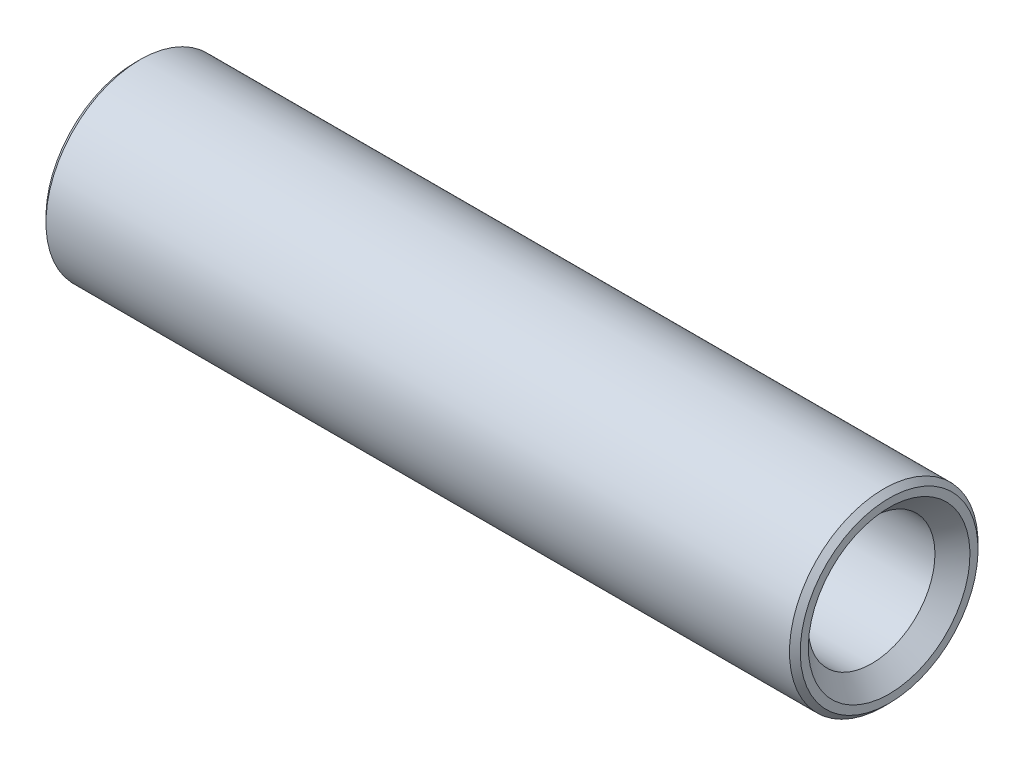
ISO-10303-21;
HEADER;
FILE_DESCRIPTION(('STEP AP214'),'2;1');
FILE_NAME('part.step','',(''),(''),'','','');
FILE_SCHEMA(('AUTOMOTIVE_DESIGN { 1 0 10303 214 1 1 1 1 }'));
ENDSEC;
DATA;
#1=APPLICATION_CONTEXT('core data for automotive mechanical design processes');
#2=APPLICATION_PROTOCOL_DEFINITION('international standard','automotive_design',2000,#1);
#3=PRODUCT_CONTEXT('',#1,'mechanical');
#4=PRODUCT('Part','Part','',(#3));
#5=PRODUCT_RELATED_PRODUCT_CATEGORY('part','',(#4));
#6=PRODUCT_DEFINITION_FORMATION('','',#4);
#7=PRODUCT_DEFINITION_CONTEXT('part definition',#1,'design');
#8=PRODUCT_DEFINITION('design','',#6,#7);
#9=PRODUCT_DEFINITION_SHAPE('','',#8);
#10=(LENGTH_UNIT() NAMED_UNIT(*) SI_UNIT(.MILLI.,.METRE.));
#11=(NAMED_UNIT(*) PLANE_ANGLE_UNIT() SI_UNIT($,.RADIAN.));
#12=(NAMED_UNIT(*) SI_UNIT($,.STERADIAN.) SOLID_ANGLE_UNIT());
#13=UNCERTAINTY_MEASURE_WITH_UNIT(LENGTH_MEASURE(1.E-05),#10,'distance_accuracy_value','');
#14=(GEOMETRIC_REPRESENTATION_CONTEXT(3) GLOBAL_UNCERTAINTY_ASSIGNED_CONTEXT((#13)) GLOBAL_UNIT_ASSIGNED_CONTEXT((#10,
#11,#12)) REPRESENTATION_CONTEXT('',''));
#15=CARTESIAN_POINT('',(0.,0.,0.));
#16=DIRECTION('',(0.,0.,1.));
#17=DIRECTION('',(1.,0.,0.));
#18=AXIS2_PLACEMENT_3D('',#15,#16,#17);
#19=CARTESIAN_POINT('',(-14.,3.5,0.));
#20=DIRECTION('',(1.,0.,0.));
#21=DIRECTION('',(0.,1.,0.));
#22=AXIS2_PLACEMENT_3D('',#19,#20,#21);
#23=PLANE('',#22);
#24=CARTESIAN_POINT('',(-14.,0.,0.));
#25=DIRECTION('',(1.,0.,0.));
#26=DIRECTION('',(0.,1.,0.));
#27=AXIS2_PLACEMENT_3D('',#24,#25,#26);
#28=CIRCLE('',#27,3.3);
#29=CARTESIAN_POINT('',(-14.,3.3,0.));
#30=VERTEX_POINT('',#29);
#31=EDGE_CURVE('E10',#30,#30,#28,.F.);
#32=ORIENTED_EDGE('',*,*,#31,.T.);
#33=EDGE_LOOP('',(#32));
#34=FACE_BOUND('',#33,.T.);
#35=CARTESIAN_POINT('',(-14.,0.,0.));
#36=DIRECTION('',(-1.,0.,0.));
#37=DIRECTION('',(0.,-1.,0.));
#38=AXIS2_PLACEMENT_3D('',#35,#36,#37);
#39=CIRCLE('',#38,3.);
#40=CARTESIAN_POINT('',(-14.,-3.,0.));
#41=VERTEX_POINT('',#40);
#42=EDGE_CURVE('E57',#41,#41,#39,.T.);
#43=ORIENTED_EDGE('',*,*,#42,.F.);
#44=EDGE_LOOP('',(#43));
#45=FACE_BOUND('',#44,.T.);
#46=ADVANCED_FACE('F37',(#34,#45),#23,.F.);
#47=CARTESIAN_POINT('',(-14.,0.,0.));
#48=DIRECTION('',(-1.,0.,0.));
#49=DIRECTION('',(0.,-1.,0.));
#50=AXIS2_PLACEMENT_3D('',#47,#48,#49);
#51=CONICAL_SURFACE('',#50,3.,0.785398163397449);
#52=CARTESIAN_POINT('',(-13.35,0.,0.));
#53=DIRECTION('',(-1.,0.,0.));
#54=DIRECTION('',(0.,-1.,0.));
#55=AXIS2_PLACEMENT_3D('',#52,#53,#54);
#56=CIRCLE('',#55,2.35);
#57=CARTESIAN_POINT('',(-13.35,-2.35,0.));
#58=VERTEX_POINT('',#57);
#59=EDGE_CURVE('E60',#58,#58,#56,.T.);
#60=ORIENTED_EDGE('',*,*,#59,.F.);
#61=EDGE_LOOP('',(#60));
#62=FACE_BOUND('',#61,.T.);
#63=ORIENTED_EDGE('',*,*,#42,.T.);
#64=EDGE_LOOP('',(#63));
#65=FACE_BOUND('',#64,.T.);
#66=ADVANCED_FACE('F81',(#62,#65),#51,.F.);
#67=CARTESIAN_POINT('',(-14.,0.,0.));
#68=DIRECTION('',(-1.,0.,0.));
#69=DIRECTION('',(0.,-1.,0.));
#70=AXIS2_PLACEMENT_3D('',#67,#68,#69);
#71=CYLINDRICAL_SURFACE('',#70,2.35);
#72=CARTESIAN_POINT('',(13.35,0.,0.));
#73=DIRECTION('',(-1.,0.,0.));
#74=DIRECTION('',(0.,-1.,0.));
#75=AXIS2_PLACEMENT_3D('',#72,#73,#74);
#76=CIRCLE('',#75,2.35);
#77=CARTESIAN_POINT('',(13.35,-2.34999999999999,0.));
#78=VERTEX_POINT('',#77);
#79=EDGE_CURVE('E63',#78,#78,#76,.T.);
#80=ORIENTED_EDGE('',*,*,#79,.F.);
#81=EDGE_LOOP('',(#80));
#82=FACE_BOUND('',#81,.T.);
#83=ORIENTED_EDGE('',*,*,#59,.T.);
#84=EDGE_LOOP('',(#83));
#85=FACE_BOUND('',#84,.T.);
#86=ADVANCED_FACE('F75',(#82,#85),#71,.F.);
#87=CARTESIAN_POINT('',(13.35,0.,0.));
#88=DIRECTION('',(1.,0.,0.));
#89=DIRECTION('',(0.,1.,0.));
#90=AXIS2_PLACEMENT_3D('',#87,#88,#89);
#91=CONICAL_SURFACE('',#90,2.35,0.78539816339745);
#92=CARTESIAN_POINT('',(14.,0.,0.));
#93=DIRECTION('',(-1.,0.,0.));
#94=DIRECTION('',(0.,-1.,0.));
#95=AXIS2_PLACEMENT_3D('',#92,#93,#94);
#96=CIRCLE('',#95,3.);
#97=CARTESIAN_POINT('',(14.,-3.,0.));
#98=VERTEX_POINT('',#97);
#99=EDGE_CURVE('E66',#98,#98,#96,.T.);
#100=ORIENTED_EDGE('',*,*,#99,.F.);
#101=EDGE_LOOP('',(#100));
#102=FACE_BOUND('',#101,.T.);
#103=ORIENTED_EDGE('',*,*,#79,.T.);
#104=EDGE_LOOP('',(#103));
#105=FACE_BOUND('',#104,.T.);
#106=ADVANCED_FACE('F72',(#102,#105),#91,.F.);
#107=CARTESIAN_POINT('',(14.,3.5,0.));
#108=DIRECTION('',(-1.,0.,0.));
#109=DIRECTION('',(0.,-1.,0.));
#110=AXIS2_PLACEMENT_3D('',#107,#108,#109);
#111=PLANE('',#110);
#112=CARTESIAN_POINT('',(14.,0.,0.));
#113=DIRECTION('',(-1.,0.,0.));
#114=DIRECTION('',(0.,-1.,0.));
#115=AXIS2_PLACEMENT_3D('',#112,#113,#114);
#116=CIRCLE('',#115,3.3);
#117=CARTESIAN_POINT('',(14.,-3.3,0.));
#118=VERTEX_POINT('',#117);
#119=EDGE_CURVE('E44',#118,#118,#116,.F.);
#120=ORIENTED_EDGE('',*,*,#119,.T.);
#121=EDGE_LOOP('',(#120));
#122=FACE_BOUND('',#121,.T.);
#123=ORIENTED_EDGE('',*,*,#99,.T.);
#124=EDGE_LOOP('',(#123));
#125=FACE_BOUND('',#124,.T.);
#126=ADVANCED_FACE('F70',(#122,#125),#111,.F.);
#127=CARTESIAN_POINT('',(-14.,0.,0.));
#128=DIRECTION('',(-1.,0.,0.));
#129=DIRECTION('',(0.,-1.,0.));
#130=AXIS2_PLACEMENT_3D('',#127,#128,#129);
#131=CYLINDRICAL_SURFACE('',#130,3.5);
#132=CARTESIAN_POINT('',(13.8,0.,0.));
#133=DIRECTION('',(-1.,0.,0.));
#134=DIRECTION('',(0.,-1.,0.));
#135=AXIS2_PLACEMENT_3D('',#132,#133,#134);
#136=CIRCLE('',#135,3.5);
#137=CARTESIAN_POINT('',(13.8,-3.5,0.));
#138=VERTEX_POINT('',#137);
#139=EDGE_CURVE('E48',#138,#138,#136,.T.);
#140=ORIENTED_EDGE('',*,*,#139,.T.);
#141=EDGE_LOOP('',(#140));
#142=FACE_BOUND('',#141,.T.);
#143=CARTESIAN_POINT('',(-13.8,0.,0.));
#144=DIRECTION('',(1.,0.,0.));
#145=DIRECTION('',(0.,1.,0.));
#146=AXIS2_PLACEMENT_3D('',#143,#144,#145);
#147=CIRCLE('',#146,3.5);
#148=CARTESIAN_POINT('',(-13.8,3.5,0.));
#149=VERTEX_POINT('',#148);
#150=EDGE_CURVE('E52',#149,#149,#147,.T.);
#151=ORIENTED_EDGE('',*,*,#150,.T.);
#152=EDGE_LOOP('',(#151));
#153=FACE_BOUND('',#152,.T.);
#154=ADVANCED_FACE('F97',(#142,#153),#131,.T.);
#155=CARTESIAN_POINT('',(13.8,0.,0.));
#156=DIRECTION('',(-1.,0.,0.));
#157=DIRECTION('',(0.,-1.,0.));
#158=AXIS2_PLACEMENT_3D('',#155,#156,#157);
#159=CONICAL_SURFACE('',#158,3.5,0.785398163397443);
#160=ORIENTED_EDGE('',*,*,#119,.F.);
#161=EDGE_LOOP('',(#160));
#162=FACE_BOUND('',#161,.T.);
#163=ORIENTED_EDGE('',*,*,#139,.F.);
#164=EDGE_LOOP('',(#163));
#165=FACE_BOUND('',#164,.T.);
#166=ADVANCED_FACE('F95',(#162,#165),#159,.T.);
#167=CARTESIAN_POINT('',(-14.,0.,0.));
#168=DIRECTION('',(1.,0.,0.));
#169=DIRECTION('',(0.,1.,0.));
#170=AXIS2_PLACEMENT_3D('',#167,#168,#169);
#171=CONICAL_SURFACE('',#170,3.3,0.785398163397446);
#172=ORIENTED_EDGE('',*,*,#150,.F.);
#173=EDGE_LOOP('',(#172));
#174=FACE_BOUND('',#173,.T.);
#175=ORIENTED_EDGE('',*,*,#31,.F.);
#176=EDGE_LOOP('',(#175));
#177=FACE_BOUND('',#176,.T.);
#178=ADVANCED_FACE('F39',(#174,#177),#171,.T.);
#179=CLOSED_SHELL('',(#46,#66,#86,#106,#126,#154,#166,#178));
#180=MANIFOLD_SOLID_BREP('B2',#179);
#181=ADVANCED_BREP_SHAPE_REPRESENTATION('',(#18,#180),#14);
#182=SHAPE_DEFINITION_REPRESENTATION(#9,#181);
ENDSEC;
END-ISO-10303-21;
